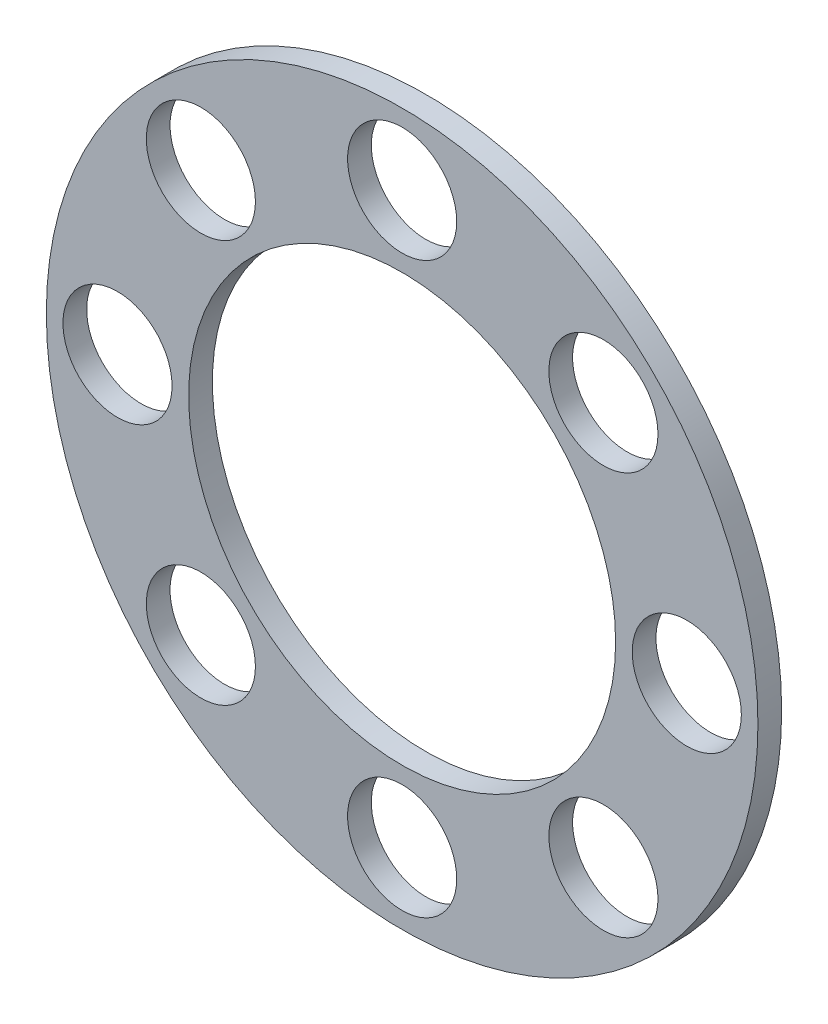
ISO-10303-21;
HEADER;
FILE_DESCRIPTION(('STEP AP214'),'2;1');
FILE_NAME('part.step','',(''),(''),'','','');
FILE_SCHEMA(('AUTOMOTIVE_DESIGN { 1 0 10303 214 1 1 1 1 }'));
ENDSEC;
DATA;
#1=APPLICATION_CONTEXT('core data for automotive mechanical design processes');
#2=APPLICATION_PROTOCOL_DEFINITION('international standard','automotive_design',2000,#1);
#3=PRODUCT_CONTEXT('',#1,'mechanical');
#4=PRODUCT('Part','Part','',(#3));
#5=PRODUCT_RELATED_PRODUCT_CATEGORY('part','',(#4));
#6=PRODUCT_DEFINITION_FORMATION('','',#4);
#7=PRODUCT_DEFINITION_CONTEXT('part definition',#1,'design');
#8=PRODUCT_DEFINITION('design','',#6,#7);
#9=PRODUCT_DEFINITION_SHAPE('','',#8);
#10=(LENGTH_UNIT() NAMED_UNIT(*) SI_UNIT(.MILLI.,.METRE.));
#11=(NAMED_UNIT(*) PLANE_ANGLE_UNIT() SI_UNIT($,.RADIAN.));
#12=(NAMED_UNIT(*) SI_UNIT($,.STERADIAN.) SOLID_ANGLE_UNIT());
#13=UNCERTAINTY_MEASURE_WITH_UNIT(LENGTH_MEASURE(1.E-05),#10,'distance_accuracy_value','');
#14=(GEOMETRIC_REPRESENTATION_CONTEXT(3) GLOBAL_UNCERTAINTY_ASSIGNED_CONTEXT((#13)) GLOBAL_UNIT_ASSIGNED_CONTEXT((#10,
#11,#12)) REPRESENTATION_CONTEXT('',''));
#15=CARTESIAN_POINT('',(0.,0.,0.));
#16=DIRECTION('',(0.,0.,1.));
#17=DIRECTION('',(1.,0.,0.));
#18=AXIS2_PLACEMENT_3D('',#15,#16,#17);
#19=CARTESIAN_POINT('',(0.,0.,0.5));
#20=DIRECTION('',(0.,0.,1.));
#21=DIRECTION('',(1.,0.,0.));
#22=AXIS2_PLACEMENT_3D('',#19,#20,#21);
#23=PLANE('',#22);
#24=CARTESIAN_POINT('',(-6.,0.,0.5));
#25=DIRECTION('',(0.,0.,1.));
#26=DIRECTION('',(1.,0.,0.));
#27=AXIS2_PLACEMENT_3D('',#24,#25,#26);
#28=CIRCLE('',#27,1.15);
#29=CARTESIAN_POINT('',(-4.85,0.,0.5));
#30=VERTEX_POINT('',#29);
#31=EDGE_CURVE('E91',#30,#30,#28,.T.);
#32=ORIENTED_EDGE('',*,*,#31,.F.);
#33=EDGE_LOOP('',(#32));
#34=FACE_BOUND('',#33,.T.);
#35=CARTESIAN_POINT('',(0.,-6.,0.5));
#36=DIRECTION('',(0.,0.,1.));
#37=DIRECTION('',(1.,0.,0.));
#38=AXIS2_PLACEMENT_3D('',#35,#36,#37);
#39=CIRCLE('',#38,1.15);
#40=CARTESIAN_POINT('',(1.14999999999996,-6.,0.5));
#41=VERTEX_POINT('',#40);
#42=EDGE_CURVE('E79',#41,#41,#39,.T.);
#43=ORIENTED_EDGE('',*,*,#42,.F.);
#44=EDGE_LOOP('',(#43));
#45=FACE_BOUND('',#44,.T.);
#46=CARTESIAN_POINT('',(6.,0.,0.5));
#47=DIRECTION('',(0.,0.,1.));
#48=DIRECTION('',(1.,0.,0.));
#49=AXIS2_PLACEMENT_3D('',#46,#47,#48);
#50=CIRCLE('',#49,1.15);
#51=CARTESIAN_POINT('',(7.15,0.,0.5));
#52=VERTEX_POINT('',#51);
#53=EDGE_CURVE('E67',#52,#52,#50,.T.);
#54=ORIENTED_EDGE('',*,*,#53,.F.);
#55=EDGE_LOOP('',(#54));
#56=FACE_BOUND('',#55,.T.);
#57=CARTESIAN_POINT('',(0.,0.,0.5));
#58=DIRECTION('',(0.,0.,1.));
#59=DIRECTION('',(1.,0.,0.));
#60=AXIS2_PLACEMENT_3D('',#57,#58,#59);
#61=CIRCLE('',#60,4.5);
#62=CARTESIAN_POINT('',(4.5,0.,0.5));
#63=VERTEX_POINT('',#62);
#64=EDGE_CURVE('E55',#63,#63,#61,.T.);
#65=ORIENTED_EDGE('',*,*,#64,.F.);
#66=EDGE_LOOP('',(#65));
#67=FACE_BOUND('',#66,.T.);
#68=CARTESIAN_POINT('',(0.,0.,0.5));
#69=DIRECTION('',(0.,0.,1.));
#70=DIRECTION('',(1.,0.,0.));
#71=AXIS2_PLACEMENT_3D('',#68,#69,#70);
#72=CIRCLE('',#71,7.5);
#73=CARTESIAN_POINT('',(7.5,0.,0.5));
#74=VERTEX_POINT('',#73);
#75=EDGE_CURVE('E10',#74,#74,#72,.T.);
#76=ORIENTED_EDGE('',*,*,#75,.T.);
#77=EDGE_LOOP('',(#76));
#78=FACE_BOUND('',#77,.T.);
#79=CARTESIAN_POINT('',(0.,6.,0.5));
#80=DIRECTION('',(0.,0.,1.));
#81=DIRECTION('',(1.,0.,0.));
#82=AXIS2_PLACEMENT_3D('',#79,#80,#81);
#83=CIRCLE('',#82,1.15);
#84=CARTESIAN_POINT('',(1.15,6.,0.5));
#85=VERTEX_POINT('',#84);
#86=EDGE_CURVE('E50',#85,#85,#83,.T.);
#87=ORIENTED_EDGE('',*,*,#86,.F.);
#88=EDGE_LOOP('',(#87));
#89=FACE_BOUND('',#88,.T.);
#90=CARTESIAN_POINT('',(4.24264068711929,4.24264068711928,0.5));
#91=DIRECTION('',(0.,0.,1.));
#92=DIRECTION('',(1.,0.,0.));
#93=AXIS2_PLACEMENT_3D('',#90,#91,#92);
#94=CIRCLE('',#93,1.15);
#95=CARTESIAN_POINT('',(5.39264068711929,4.24264068711928,0.5));
#96=VERTEX_POINT('',#95);
#97=EDGE_CURVE('E61',#96,#96,#94,.T.);
#98=ORIENTED_EDGE('',*,*,#97,.F.);
#99=EDGE_LOOP('',(#98));
#100=FACE_BOUND('',#99,.T.);
#101=CARTESIAN_POINT('',(4.24264068711926,-4.24264068711931,0.5));
#102=DIRECTION('',(0.,0.,1.));
#103=DIRECTION('',(1.,0.,0.));
#104=AXIS2_PLACEMENT_3D('',#101,#102,#103);
#105=CIRCLE('',#104,1.15);
#106=CARTESIAN_POINT('',(5.39264068711926,-4.24264068711931,0.5));
#107=VERTEX_POINT('',#106);
#108=EDGE_CURVE('E73',#107,#107,#105,.T.);
#109=ORIENTED_EDGE('',*,*,#108,.F.);
#110=EDGE_LOOP('',(#109));
#111=FACE_BOUND('',#110,.T.);
#112=CARTESIAN_POINT('',(-4.24264068711932,-4.24264068711925,0.5));
#113=DIRECTION('',(0.,0.,1.));
#114=DIRECTION('',(1.,0.,0.));
#115=AXIS2_PLACEMENT_3D('',#112,#113,#114);
#116=CIRCLE('',#115,1.15);
#117=CARTESIAN_POINT('',(-3.09264068711932,-4.24264068711925,0.5));
#118=VERTEX_POINT('',#117);
#119=EDGE_CURVE('E85',#118,#118,#116,.T.);
#120=ORIENTED_EDGE('',*,*,#119,.F.);
#121=EDGE_LOOP('',(#120));
#122=FACE_BOUND('',#121,.T.);
#123=CARTESIAN_POINT('',(-4.24264068711924,4.24264068711934,0.5));
#124=DIRECTION('',(0.,0.,1.));
#125=DIRECTION('',(1.,0.,0.));
#126=AXIS2_PLACEMENT_3D('',#123,#124,#125);
#127=CIRCLE('',#126,1.15);
#128=CARTESIAN_POINT('',(-3.09264068711924,4.24264068711934,0.5));
#129=VERTEX_POINT('',#128);
#130=EDGE_CURVE('E97',#129,#129,#127,.T.);
#131=ORIENTED_EDGE('',*,*,#130,.F.);
#132=EDGE_LOOP('',(#131));
#133=FACE_BOUND('',#132,.T.);
#134=ADVANCED_FACE('F39',(#34,#45,#56,#67,#78,#89,#100,#111,#122,#133),#23,.T.);
#135=CARTESIAN_POINT('',(0.,0.,0.));
#136=DIRECTION('',(0.,0.,1.));
#137=DIRECTION('',(1.,0.,0.));
#138=AXIS2_PLACEMENT_3D('',#135,#136,#137);
#139=PLANE('',#138);
#140=CARTESIAN_POINT('',(0.,0.,0.));
#141=DIRECTION('',(0.,0.,1.));
#142=DIRECTION('',(1.,0.,0.));
#143=AXIS2_PLACEMENT_3D('',#140,#141,#142);
#144=CIRCLE('',#143,7.5);
#145=CARTESIAN_POINT('',(7.5,0.,0.));
#146=VERTEX_POINT('',#145);
#147=EDGE_CURVE('E43',#146,#146,#144,.T.);
#148=ORIENTED_EDGE('',*,*,#147,.F.);
#149=EDGE_LOOP('',(#148));
#150=FACE_BOUND('',#149,.T.);
#151=CARTESIAN_POINT('',(0.,6.,0.));
#152=DIRECTION('',(0.,0.,1.));
#153=DIRECTION('',(1.,0.,0.));
#154=AXIS2_PLACEMENT_3D('',#151,#152,#153);
#155=CIRCLE('',#154,1.15);
#156=CARTESIAN_POINT('',(1.15,6.,0.));
#157=VERTEX_POINT('',#156);
#158=EDGE_CURVE('E52',#157,#157,#155,.T.);
#159=ORIENTED_EDGE('',*,*,#158,.T.);
#160=EDGE_LOOP('',(#159));
#161=FACE_BOUND('',#160,.T.);
#162=CARTESIAN_POINT('',(0.,0.,0.));
#163=DIRECTION('',(0.,0.,1.));
#164=DIRECTION('',(1.,0.,0.));
#165=AXIS2_PLACEMENT_3D('',#162,#163,#164);
#166=CIRCLE('',#165,4.5);
#167=CARTESIAN_POINT('',(4.5,0.,0.));
#168=VERTEX_POINT('',#167);
#169=EDGE_CURVE('E58',#168,#168,#166,.T.);
#170=ORIENTED_EDGE('',*,*,#169,.T.);
#171=EDGE_LOOP('',(#170));
#172=FACE_BOUND('',#171,.T.);
#173=CARTESIAN_POINT('',(4.24264068711929,4.24264068711928,0.));
#174=DIRECTION('',(0.,0.,1.));
#175=DIRECTION('',(1.,0.,0.));
#176=AXIS2_PLACEMENT_3D('',#173,#174,#175);
#177=CIRCLE('',#176,1.15);
#178=CARTESIAN_POINT('',(5.39264068711929,4.24264068711928,0.));
#179=VERTEX_POINT('',#178);
#180=EDGE_CURVE('E64',#179,#179,#177,.T.);
#181=ORIENTED_EDGE('',*,*,#180,.T.);
#182=EDGE_LOOP('',(#181));
#183=FACE_BOUND('',#182,.T.);
#184=CARTESIAN_POINT('',(6.,0.,0.));
#185=DIRECTION('',(0.,0.,1.));
#186=DIRECTION('',(1.,0.,0.));
#187=AXIS2_PLACEMENT_3D('',#184,#185,#186);
#188=CIRCLE('',#187,1.15);
#189=CARTESIAN_POINT('',(7.15,0.,0.));
#190=VERTEX_POINT('',#189);
#191=EDGE_CURVE('E70',#190,#190,#188,.T.);
#192=ORIENTED_EDGE('',*,*,#191,.T.);
#193=EDGE_LOOP('',(#192));
#194=FACE_BOUND('',#193,.T.);
#195=CARTESIAN_POINT('',(4.24264068711926,-4.24264068711931,0.));
#196=DIRECTION('',(0.,0.,1.));
#197=DIRECTION('',(1.,0.,0.));
#198=AXIS2_PLACEMENT_3D('',#195,#196,#197);
#199=CIRCLE('',#198,1.15);
#200=CARTESIAN_POINT('',(5.39264068711926,-4.24264068711931,0.));
#201=VERTEX_POINT('',#200);
#202=EDGE_CURVE('E76',#201,#201,#199,.T.);
#203=ORIENTED_EDGE('',*,*,#202,.T.);
#204=EDGE_LOOP('',(#203));
#205=FACE_BOUND('',#204,.T.);
#206=CARTESIAN_POINT('',(0.,-6.,0.));
#207=DIRECTION('',(0.,0.,1.));
#208=DIRECTION('',(1.,0.,0.));
#209=AXIS2_PLACEMENT_3D('',#206,#207,#208);
#210=CIRCLE('',#209,1.15);
#211=CARTESIAN_POINT('',(1.14999999999996,-6.,0.));
#212=VERTEX_POINT('',#211);
#213=EDGE_CURVE('E82',#212,#212,#210,.T.);
#214=ORIENTED_EDGE('',*,*,#213,.T.);
#215=EDGE_LOOP('',(#214));
#216=FACE_BOUND('',#215,.T.);
#217=CARTESIAN_POINT('',(-4.24264068711932,-4.24264068711925,0.));
#218=DIRECTION('',(0.,0.,1.));
#219=DIRECTION('',(1.,0.,0.));
#220=AXIS2_PLACEMENT_3D('',#217,#218,#219);
#221=CIRCLE('',#220,1.15);
#222=CARTESIAN_POINT('',(-3.09264068711932,-4.24264068711925,0.));
#223=VERTEX_POINT('',#222);
#224=EDGE_CURVE('E88',#223,#223,#221,.T.);
#225=ORIENTED_EDGE('',*,*,#224,.T.);
#226=EDGE_LOOP('',(#225));
#227=FACE_BOUND('',#226,.T.);
#228=CARTESIAN_POINT('',(-6.,0.,0.));
#229=DIRECTION('',(0.,0.,1.));
#230=DIRECTION('',(1.,0.,0.));
#231=AXIS2_PLACEMENT_3D('',#228,#229,#230);
#232=CIRCLE('',#231,1.15);
#233=CARTESIAN_POINT('',(-4.85,0.,0.));
#234=VERTEX_POINT('',#233);
#235=EDGE_CURVE('E94',#234,#234,#232,.T.);
#236=ORIENTED_EDGE('',*,*,#235,.T.);
#237=EDGE_LOOP('',(#236));
#238=FACE_BOUND('',#237,.T.);
#239=CARTESIAN_POINT('',(-4.24264068711924,4.24264068711934,0.));
#240=DIRECTION('',(0.,0.,1.));
#241=DIRECTION('',(1.,0.,0.));
#242=AXIS2_PLACEMENT_3D('',#239,#240,#241);
#243=CIRCLE('',#242,1.15);
#244=CARTESIAN_POINT('',(-3.09264068711924,4.24264068711934,0.));
#245=VERTEX_POINT('',#244);
#246=EDGE_CURVE('E100',#245,#245,#243,.T.);
#247=ORIENTED_EDGE('',*,*,#246,.T.);
#248=EDGE_LOOP('',(#247));
#249=FACE_BOUND('',#248,.T.);
#250=ADVANCED_FACE('F110',(#150,#161,#172,#183,#194,#205,#216,#227,#238,#249),#139,.F.);
#251=CARTESIAN_POINT('',(0.,0.,0.5));
#252=DIRECTION('',(0.,0.,-1.));
#253=DIRECTION('',(-1.,0.,0.));
#254=AXIS2_PLACEMENT_3D('',#251,#252,#253);
#255=CYLINDRICAL_SURFACE('',#254,7.5);
#256=ORIENTED_EDGE('',*,*,#75,.F.);
#257=EDGE_LOOP('',(#256));
#258=FACE_BOUND('',#257,.T.);
#259=ORIENTED_EDGE('',*,*,#147,.T.);
#260=EDGE_LOOP('',(#259));
#261=FACE_BOUND('',#260,.T.);
#262=ADVANCED_FACE('F41',(#258,#261),#255,.T.);
#263=CARTESIAN_POINT('',(0.,6.,0.5));
#264=DIRECTION('',(0.,0.,-1.));
#265=DIRECTION('',(-1.,0.,0.));
#266=AXIS2_PLACEMENT_3D('',#263,#264,#265);
#267=CYLINDRICAL_SURFACE('',#266,1.15);
#268=ORIENTED_EDGE('',*,*,#86,.T.);
#269=EDGE_LOOP('',(#268));
#270=FACE_BOUND('',#269,.T.);
#271=ORIENTED_EDGE('',*,*,#158,.F.);
#272=EDGE_LOOP('',(#271));
#273=FACE_BOUND('',#272,.T.);
#274=ADVANCED_FACE('F120',(#270,#273),#267,.F.);
#275=CARTESIAN_POINT('',(0.,0.,0.5));
#276=DIRECTION('',(0.,0.,-1.));
#277=DIRECTION('',(-1.,0.,0.));
#278=AXIS2_PLACEMENT_3D('',#275,#276,#277);
#279=CYLINDRICAL_SURFACE('',#278,4.5);
#280=ORIENTED_EDGE('',*,*,#64,.T.);
#281=EDGE_LOOP('',(#280));
#282=FACE_BOUND('',#281,.T.);
#283=ORIENTED_EDGE('',*,*,#169,.F.);
#284=EDGE_LOOP('',(#283));
#285=FACE_BOUND('',#284,.T.);
#286=ADVANCED_FACE('F123',(#282,#285),#279,.F.);
#287=CARTESIAN_POINT('',(4.24264068711929,4.24264068711928,0.5));
#288=DIRECTION('',(0.,0.,-1.));
#289=DIRECTION('',(-1.,0.,0.));
#290=AXIS2_PLACEMENT_3D('',#287,#288,#289);
#291=CYLINDRICAL_SURFACE('',#290,1.15);
#292=ORIENTED_EDGE('',*,*,#97,.T.);
#293=EDGE_LOOP('',(#292));
#294=FACE_BOUND('',#293,.T.);
#295=ORIENTED_EDGE('',*,*,#180,.F.);
#296=EDGE_LOOP('',(#295));
#297=FACE_BOUND('',#296,.T.);
#298=ADVANCED_FACE('F127',(#294,#297),#291,.F.);
#299=CARTESIAN_POINT('',(6.,0.,0.5));
#300=DIRECTION('',(0.,0.,-1.));
#301=DIRECTION('',(-1.,0.,0.));
#302=AXIS2_PLACEMENT_3D('',#299,#300,#301);
#303=CYLINDRICAL_SURFACE('',#302,1.15);
#304=ORIENTED_EDGE('',*,*,#53,.T.);
#305=EDGE_LOOP('',(#304));
#306=FACE_BOUND('',#305,.T.);
#307=ORIENTED_EDGE('',*,*,#191,.F.);
#308=EDGE_LOOP('',(#307));
#309=FACE_BOUND('',#308,.T.);
#310=ADVANCED_FACE('F131',(#306,#309),#303,.F.);
#311=CARTESIAN_POINT('',(4.24264068711926,-4.24264068711931,0.5));
#312=DIRECTION('',(0.,0.,-1.));
#313=DIRECTION('',(-1.,0.,0.));
#314=AXIS2_PLACEMENT_3D('',#311,#312,#313);
#315=CYLINDRICAL_SURFACE('',#314,1.15);
#316=ORIENTED_EDGE('',*,*,#108,.T.);
#317=EDGE_LOOP('',(#316));
#318=FACE_BOUND('',#317,.T.);
#319=ORIENTED_EDGE('',*,*,#202,.F.);
#320=EDGE_LOOP('',(#319));
#321=FACE_BOUND('',#320,.T.);
#322=ADVANCED_FACE('F135',(#318,#321),#315,.F.);
#323=CARTESIAN_POINT('',(0.,-6.,0.5));
#324=DIRECTION('',(0.,0.,-1.));
#325=DIRECTION('',(-1.,0.,0.));
#326=AXIS2_PLACEMENT_3D('',#323,#324,#325);
#327=CYLINDRICAL_SURFACE('',#326,1.15);
#328=ORIENTED_EDGE('',*,*,#42,.T.);
#329=EDGE_LOOP('',(#328));
#330=FACE_BOUND('',#329,.T.);
#331=ORIENTED_EDGE('',*,*,#213,.F.);
#332=EDGE_LOOP('',(#331));
#333=FACE_BOUND('',#332,.T.);
#334=ADVANCED_FACE('F139',(#330,#333),#327,.F.);
#335=CARTESIAN_POINT('',(-4.24264068711932,-4.24264068711925,0.5));
#336=DIRECTION('',(0.,0.,-1.));
#337=DIRECTION('',(-1.,0.,0.));
#338=AXIS2_PLACEMENT_3D('',#335,#336,#337);
#339=CYLINDRICAL_SURFACE('',#338,1.15);
#340=ORIENTED_EDGE('',*,*,#119,.T.);
#341=EDGE_LOOP('',(#340));
#342=FACE_BOUND('',#341,.T.);
#343=ORIENTED_EDGE('',*,*,#224,.F.);
#344=EDGE_LOOP('',(#343));
#345=FACE_BOUND('',#344,.T.);
#346=ADVANCED_FACE('F143',(#342,#345),#339,.F.);
#347=CARTESIAN_POINT('',(-6.,0.,0.5));
#348=DIRECTION('',(0.,0.,-1.));
#349=DIRECTION('',(-1.,0.,0.));
#350=AXIS2_PLACEMENT_3D('',#347,#348,#349);
#351=CYLINDRICAL_SURFACE('',#350,1.15);
#352=ORIENTED_EDGE('',*,*,#31,.T.);
#353=EDGE_LOOP('',(#352));
#354=FACE_BOUND('',#353,.T.);
#355=ORIENTED_EDGE('',*,*,#235,.F.);
#356=EDGE_LOOP('',(#355));
#357=FACE_BOUND('',#356,.T.);
#358=ADVANCED_FACE('F147',(#354,#357),#351,.F.);
#359=CARTESIAN_POINT('',(-4.24264068711924,4.24264068711934,0.5));
#360=DIRECTION('',(0.,0.,-1.));
#361=DIRECTION('',(-1.,0.,0.));
#362=AXIS2_PLACEMENT_3D('',#359,#360,#361);
#363=CYLINDRICAL_SURFACE('',#362,1.15);
#364=ORIENTED_EDGE('',*,*,#130,.T.);
#365=EDGE_LOOP('',(#364));
#366=FACE_BOUND('',#365,.T.);
#367=ORIENTED_EDGE('',*,*,#246,.F.);
#368=EDGE_LOOP('',(#367));
#369=FACE_BOUND('',#368,.T.);
#370=ADVANCED_FACE('F106',(#366,#369),#363,.F.);
#371=CLOSED_SHELL('',(#134,#250,#262,#274,#286,#298,#310,#322,#334,#346,#358,#370));
#372=MANIFOLD_SOLID_BREP('B2',#371);
#373=ADVANCED_BREP_SHAPE_REPRESENTATION('',(#18,#372),#14);
#374=SHAPE_DEFINITION_REPRESENTATION(#9,#373);
ENDSEC;
END-ISO-10303-21;
